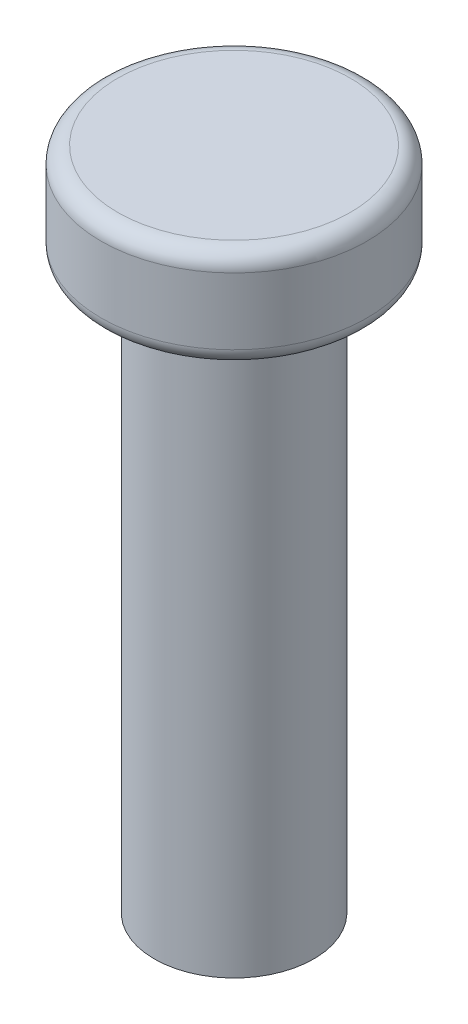
ISO-10303-21;
HEADER;
FILE_DESCRIPTION(('STEP AP214'),'2;1');
FILE_NAME('part.step','',(''),(''),'','','');
FILE_SCHEMA(('AUTOMOTIVE_DESIGN { 1 0 10303 214 1 1 1 1 }'));
ENDSEC;
DATA;
#1=APPLICATION_CONTEXT('core data for automotive mechanical design processes');
#2=APPLICATION_PROTOCOL_DEFINITION('international standard','automotive_design',2000,#1);
#3=PRODUCT_CONTEXT('',#1,'mechanical');
#4=PRODUCT('Part','Part','',(#3));
#5=PRODUCT_RELATED_PRODUCT_CATEGORY('part','',(#4));
#6=PRODUCT_DEFINITION_FORMATION('','',#4);
#7=PRODUCT_DEFINITION_CONTEXT('part definition',#1,'design');
#8=PRODUCT_DEFINITION('design','',#6,#7);
#9=PRODUCT_DEFINITION_SHAPE('','',#8);
#10=(LENGTH_UNIT() NAMED_UNIT(*) SI_UNIT(.MILLI.,.METRE.));
#11=(NAMED_UNIT(*) PLANE_ANGLE_UNIT() SI_UNIT($,.RADIAN.));
#12=(NAMED_UNIT(*) SI_UNIT($,.STERADIAN.) SOLID_ANGLE_UNIT());
#13=UNCERTAINTY_MEASURE_WITH_UNIT(LENGTH_MEASURE(1.E-05),#10,'distance_accuracy_value','');
#14=(GEOMETRIC_REPRESENTATION_CONTEXT(3) GLOBAL_UNCERTAINTY_ASSIGNED_CONTEXT((#13)) GLOBAL_UNIT_ASSIGNED_CONTEXT((#10,
#11,#12)) REPRESENTATION_CONTEXT('',''));
#15=CARTESIAN_POINT('',(0.,0.,0.));
#16=DIRECTION('',(0.,0.,1.));
#17=DIRECTION('',(1.,0.,0.));
#18=AXIS2_PLACEMENT_3D('',#15,#16,#17);
#19=CARTESIAN_POINT('',(0.,17.,0.));
#20=DIRECTION('',(0.,-1.,0.));
#21=DIRECTION('',(0.,0.,-1.));
#22=AXIS2_PLACEMENT_3D('',#19,#20,#21);
#23=CYLINDRICAL_SURFACE('',#22,2.4);
#24=CARTESIAN_POINT('',(0.,17.,0.));
#25=DIRECTION('',(0.,1.,0.));
#26=DIRECTION('',(0.,0.,1.));
#27=AXIS2_PLACEMENT_3D('',#24,#25,#26);
#28=CIRCLE('',#27,2.4);
#29=CARTESIAN_POINT('',(0.,17.,2.4));
#30=VERTEX_POINT('',#29);
#31=EDGE_CURVE('E66',#30,#30,#28,.T.);
#32=ORIENTED_EDGE('',*,*,#31,.F.);
#33=EDGE_LOOP('',(#32));
#34=FACE_BOUND('',#33,.T.);
#35=CARTESIAN_POINT('',(0.,0.,0.));
#36=DIRECTION('',(0.,1.,0.));
#37=DIRECTION('',(0.,0.,1.));
#38=AXIS2_PLACEMENT_3D('',#35,#36,#37);
#39=CIRCLE('',#38,2.4);
#40=CARTESIAN_POINT('',(0.,0.,2.4));
#41=VERTEX_POINT('',#40);
#42=EDGE_CURVE('E67',#41,#41,#39,.T.);
#43=ORIENTED_EDGE('',*,*,#42,.T.);
#44=EDGE_LOOP('',(#43));
#45=FACE_BOUND('',#44,.T.);
#46=ADVANCED_FACE('F42',(#34,#45),#23,.T.);
#47=CARTESIAN_POINT('',(0.,0.,0.));
#48=DIRECTION('',(0.,1.,0.));
#49=DIRECTION('',(0.,0.,1.));
#50=AXIS2_PLACEMENT_3D('',#47,#48,#49);
#51=PLANE('',#50);
#52=ORIENTED_EDGE('',*,*,#42,.F.);
#53=EDGE_LOOP('',(#52));
#54=FACE_BOUND('',#53,.T.);
#55=ADVANCED_FACE('F79',(#54),#51,.F.);
#56=CARTESIAN_POINT('',(0.,20.,0.));
#57=DIRECTION('',(0.,-1.,0.));
#58=DIRECTION('',(0.,0.,-1.));
#59=AXIS2_PLACEMENT_3D('',#56,#57,#58);
#60=CYLINDRICAL_SURFACE('',#59,4.);
#61=CARTESIAN_POINT('',(0.,17.5,0.));
#62=DIRECTION('',(0.,1.,0.));
#63=DIRECTION('',(0.,0.,1.));
#64=AXIS2_PLACEMENT_3D('',#61,#62,#63);
#65=CIRCLE('',#64,4.);
#66=CARTESIAN_POINT('',(0.,17.5,4.));
#67=VERTEX_POINT('',#66);
#68=EDGE_CURVE('E55',#67,#67,#65,.T.);
#69=ORIENTED_EDGE('',*,*,#68,.T.);
#70=EDGE_LOOP('',(#69));
#71=FACE_BOUND('',#70,.T.);
#72=CARTESIAN_POINT('',(0.,19.5,0.));
#73=DIRECTION('',(0.,1.,0.));
#74=DIRECTION('',(0.,0.,1.));
#75=AXIS2_PLACEMENT_3D('',#72,#73,#74);
#76=CIRCLE('',#75,4.);
#77=CARTESIAN_POINT('',(0.,19.5,4.));
#78=VERTEX_POINT('',#77);
#79=EDGE_CURVE('E60',#78,#78,#76,.F.);
#80=ORIENTED_EDGE('',*,*,#79,.T.);
#81=EDGE_LOOP('',(#80));
#82=FACE_BOUND('',#81,.T.);
#83=ADVANCED_FACE('F84',(#71,#82),#60,.T.);
#84=CARTESIAN_POINT('',(0.,20.,0.));
#85=DIRECTION('',(0.,1.,0.));
#86=DIRECTION('',(0.,0.,1.));
#87=AXIS2_PLACEMENT_3D('',#84,#85,#86);
#88=PLANE('',#87);
#89=CARTESIAN_POINT('',(0.,20.,0.));
#90=DIRECTION('',(0.,1.,0.));
#91=DIRECTION('',(0.,0.,1.));
#92=AXIS2_PLACEMENT_3D('',#89,#90,#91);
#93=CIRCLE('',#92,3.5);
#94=CARTESIAN_POINT('',(0.,20.,3.5));
#95=VERTEX_POINT('',#94);
#96=EDGE_CURVE('E10',#95,#95,#93,.T.);
#97=ORIENTED_EDGE('',*,*,#96,.T.);
#98=EDGE_LOOP('',(#97));
#99=FACE_BOUND('',#98,.T.);
#100=ADVANCED_FACE('F89',(#99),#88,.T.);
#101=CARTESIAN_POINT('',(0.,17.,0.));
#102=DIRECTION('',(0.,1.,0.));
#103=DIRECTION('',(0.,0.,1.));
#104=AXIS2_PLACEMENT_3D('',#101,#102,#103);
#105=PLANE('',#104);
#106=CARTESIAN_POINT('',(0.,17.,0.));
#107=DIRECTION('',(0.,1.,0.));
#108=DIRECTION('',(0.,0.,1.));
#109=AXIS2_PLACEMENT_3D('',#106,#107,#108);
#110=CIRCLE('',#109,3.5);
#111=CARTESIAN_POINT('',(0.,17.,3.5));
#112=VERTEX_POINT('',#111);
#113=EDGE_CURVE('E50',#112,#112,#110,.F.);
#114=ORIENTED_EDGE('',*,*,#113,.T.);
#115=EDGE_LOOP('',(#114));
#116=FACE_BOUND('',#115,.T.);
#117=ORIENTED_EDGE('',*,*,#31,.T.);
#118=EDGE_LOOP('',(#117));
#119=FACE_BOUND('',#118,.T.);
#120=ADVANCED_FACE('F75',(#116,#119),#105,.F.);
#121=CARTESIAN_POINT('',(0.,17.5,0.));
#122=DIRECTION('',(0.,1.,0.));
#123=DIRECTION('',(0.,0.,1.));
#124=AXIS2_PLACEMENT_3D('',#121,#122,#123);
#125=TOROIDAL_SURFACE('',#124,3.5,0.5);
#126=ORIENTED_EDGE('',*,*,#113,.F.);
#127=EDGE_LOOP('',(#126));
#128=FACE_BOUND('',#127,.T.);
#129=ORIENTED_EDGE('',*,*,#68,.F.);
#130=EDGE_LOOP('',(#129));
#131=FACE_BOUND('',#130,.T.);
#132=ADVANCED_FACE('F93',(#128,#131),#125,.T.);
#133=CARTESIAN_POINT('',(0.,19.5,0.));
#134=DIRECTION('',(0.,1.,0.));
#135=DIRECTION('',(0.,0.,1.));
#136=AXIS2_PLACEMENT_3D('',#133,#134,#135);
#137=TOROIDAL_SURFACE('',#136,3.5,0.5);
#138=ORIENTED_EDGE('',*,*,#79,.F.);
#139=EDGE_LOOP('',(#138));
#140=FACE_BOUND('',#139,.T.);
#141=ORIENTED_EDGE('',*,*,#96,.F.);
#142=EDGE_LOOP('',(#141));
#143=FACE_BOUND('',#142,.T.);
#144=ADVANCED_FACE('F44',(#140,#143),#137,.T.);
#145=CLOSED_SHELL('',(#46,#55,#83,#100,#120,#132,#144));
#146=MANIFOLD_SOLID_BREP('B2',#145);
#147=ADVANCED_BREP_SHAPE_REPRESENTATION('',(#18,#146),#14);
#148=SHAPE_DEFINITION_REPRESENTATION(#9,#147);
ENDSEC;
END-ISO-10303-21;
